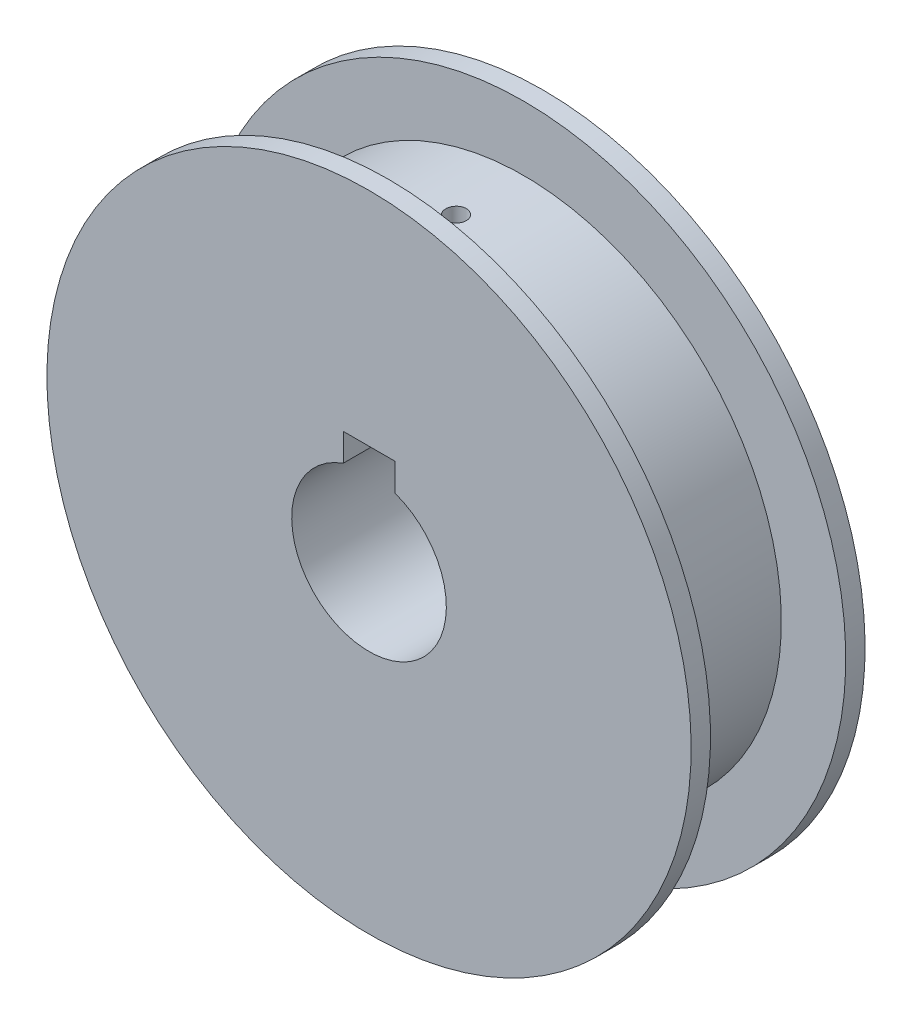
ISO-10303-21;
HEADER;
FILE_DESCRIPTION(('STEP AP214'),'2;1');
FILE_NAME('part.step','',(''),(''),'','','');
FILE_SCHEMA(('AUTOMOTIVE_DESIGN { 1 0 10303 214 1 1 1 1 }'));
ENDSEC;
DATA;
#1=APPLICATION_CONTEXT('core data for automotive mechanical design processes');
#2=APPLICATION_PROTOCOL_DEFINITION('international standard','automotive_design',2000,#1);
#3=PRODUCT_CONTEXT('',#1,'mechanical');
#4=PRODUCT('Part','Part','',(#3));
#5=PRODUCT_RELATED_PRODUCT_CATEGORY('part','',(#4));
#6=PRODUCT_DEFINITION_FORMATION('','',#4);
#7=PRODUCT_DEFINITION_CONTEXT('part definition',#1,'design');
#8=PRODUCT_DEFINITION('design','',#6,#7);
#9=PRODUCT_DEFINITION_SHAPE('','',#8);
#10=(LENGTH_UNIT() NAMED_UNIT(*) SI_UNIT(.MILLI.,.METRE.));
#11=(NAMED_UNIT(*) PLANE_ANGLE_UNIT() SI_UNIT($,.RADIAN.));
#12=(NAMED_UNIT(*) SI_UNIT($,.STERADIAN.) SOLID_ANGLE_UNIT());
#13=UNCERTAINTY_MEASURE_WITH_UNIT(LENGTH_MEASURE(1.E-05),#10,'distance_accuracy_value','');
#14=(GEOMETRIC_REPRESENTATION_CONTEXT(3) GLOBAL_UNCERTAINTY_ASSIGNED_CONTEXT((#13)) GLOBAL_UNIT_ASSIGNED_CONTEXT((#10,
#11,#12)) REPRESENTATION_CONTEXT('',''));
#15=CARTESIAN_POINT('',(0.,0.,0.));
#16=DIRECTION('',(0.,0.,1.));
#17=DIRECTION('',(1.,0.,0.));
#18=AXIS2_PLACEMENT_3D('',#15,#16,#17);
#19=CARTESIAN_POINT('',(-5.,25.001,-1.5));
#20=DIRECTION('',(1.,0.,0.));
#21=DIRECTION('',(0.,0.,-1.));
#22=AXIS2_PLACEMENT_3D('',#19,#20,#21);
#23=PLANE('',#22);
#24=DIRECTION('',(0.,0.,1.));
#25=VECTOR('',#24,1.);
#26=CARTESIAN_POINT('',(-5.,-24.4948974278318,-27.8315493850579));
#27=LINE('',#26,#25);
#28=CARTESIAN_POINT('',(-5.,-24.4948974278318,-9.));
#29=VERTEX_POINT('',#28);
#30=CARTESIAN_POINT('',(-5.,-24.4948974278318,-4.5));
#31=VERTEX_POINT('',#30);
#32=EDGE_CURVE('E303',#29,#31,#27,.T.);
#33=ORIENTED_EDGE('',*,*,#32,.T.);
#34=DIRECTION('',(0.,1.,0.));
#35=VECTOR('',#34,1.);
#36=CARTESIAN_POINT('',(-5.,25.001,-4.5));
#37=LINE('',#36,#35);
#38=CARTESIAN_POINT('',(-5.,-19.3649167310371,-4.5));
#39=VERTEX_POINT('',#38);
#40=EDGE_CURVE('E251',#31,#39,#37,.T.);
#41=ORIENTED_EDGE('',*,*,#40,.T.);
#42=DIRECTION('',(0.,0.,-1.));
#43=VECTOR('',#42,1.);
#44=CARTESIAN_POINT('',(-5.,-19.3649167310371,-13.5));
#45=LINE('',#44,#43);
#46=CARTESIAN_POINT('',(-5.,-19.3649167310371,-9.));
#47=VERTEX_POINT('',#46);
#48=EDGE_CURVE('E60',#39,#47,#45,.T.);
#49=ORIENTED_EDGE('',*,*,#48,.T.);
#50=DIRECTION('',(0.,1.,0.));
#51=VECTOR('',#50,1.);
#52=CARTESIAN_POINT('',(-5.,25.001,-9.));
#53=LINE('',#52,#51);
#54=EDGE_CURVE('E443',#29,#47,#53,.T.);
#55=ORIENTED_EDGE('',*,*,#54,.F.);
#56=EDGE_LOOP('',(#33,#41,#49,#55));
#57=FACE_BOUND('',#56,.T.);
#58=ADVANCED_FACE('F37',(#57),#23,.F.);
#59=CARTESIAN_POINT('',(0.,0.,-13.5));
#60=DIRECTION('',(0.,0.,-1.));
#61=DIRECTION('',(0.,1.,0.));
#62=AXIS2_PLACEMENT_3D('',#59,#60,#61);
#63=CYLINDRICAL_SURFACE('',#62,25.);
#64=CARTESIAN_POINT('',(0.,0.,-3.));
#65=DIRECTION('',(0.,0.,1.));
#66=DIRECTION('',(0.,-1.,0.));
#67=AXIS2_PLACEMENT_3D('',#64,#65,#66);
#68=CIRCLE('',#67,25.);
#69=CARTESIAN_POINT('',(-2.5,-24.8746859276655,-3.));
#70=VERTEX_POINT('',#69);
#71=CARTESIAN_POINT('',(-5.,-24.4948974278318,-3.));
#72=VERTEX_POINT('',#71);
#73=EDGE_CURVE('E249',#70,#72,#68,.F.);
#74=ORIENTED_EDGE('',*,*,#73,.F.);
#75=DIRECTION('',(0.,0.,-1.));
#76=VECTOR('',#75,1.);
#77=CARTESIAN_POINT('',(-2.5,-24.8746859276655,-13.5));
#78=LINE('',#77,#76);
#79=CARTESIAN_POINT('',(-2.5,-24.8746859276655,-1.49999999999999));
#80=VERTEX_POINT('',#79);
#81=EDGE_CURVE('E11',#80,#70,#78,.T.);
#82=ORIENTED_EDGE('',*,*,#81,.F.);
#83=CARTESIAN_POINT('',(0.,0.,-1.5));
#84=DIRECTION('',(0.,0.,1.));
#85=DIRECTION('',(0.,-1.,0.));
#86=AXIS2_PLACEMENT_3D('',#83,#84,#85);
#87=CIRCLE('',#86,25.);
#88=CARTESIAN_POINT('',(2.5,-24.8746859276655,-1.49999999999999));
#89=VERTEX_POINT('',#88);
#90=EDGE_CURVE('E469',#89,#80,#87,.F.);
#91=ORIENTED_EDGE('',*,*,#90,.F.);
#92=DIRECTION('',(0.,0.,-1.));
#93=VECTOR('',#92,1.);
#94=CARTESIAN_POINT('',(2.5,-24.8746859276655,-13.5));
#95=LINE('',#94,#93);
#96=CARTESIAN_POINT('',(2.5,-24.8746859276655,-5.99999999999999));
#97=VERTEX_POINT('',#96);
#98=EDGE_CURVE('E473',#97,#89,#95,.F.);
#99=ORIENTED_EDGE('',*,*,#98,.F.);
#100=CARTESIAN_POINT('',(0.,0.,-6.));
#101=DIRECTION('',(0.,0.,-1.));
#102=DIRECTION('',(0.,1.,0.));
#103=AXIS2_PLACEMENT_3D('',#100,#101,#102);
#104=CIRCLE('',#103,25.);
#105=CARTESIAN_POINT('',(-2.5,-24.8746859276655,-6.));
#106=VERTEX_POINT('',#105);
#107=EDGE_CURVE('E471',#106,#97,#104,.F.);
#108=ORIENTED_EDGE('',*,*,#107,.F.);
#109=DIRECTION('',(0.,0.,-1.));
#110=VECTOR('',#109,1.);
#111=CARTESIAN_POINT('',(-2.5,-24.8746859276655,-13.5));
#112=LINE('',#111,#110);
#113=CARTESIAN_POINT('',(-2.5,-24.8746859276655,-4.5));
#114=VERTEX_POINT('',#113);
#115=EDGE_CURVE('E45',#114,#106,#112,.T.);
#116=ORIENTED_EDGE('',*,*,#115,.F.);
#117=CARTESIAN_POINT('',(0.,0.,-4.5));
#118=DIRECTION('',(0.,0.,-1.));
#119=DIRECTION('',(0.,1.,0.));
#120=AXIS2_PLACEMENT_3D('',#117,#118,#119);
#121=CIRCLE('',#120,25.);
#122=EDGE_CURVE('E253',#31,#114,#121,.F.);
#123=ORIENTED_EDGE('',*,*,#122,.F.);
#124=ORIENTED_EDGE('',*,*,#32,.F.);
#125=CARTESIAN_POINT('',(0.,0.,-9.));
#126=DIRECTION('',(0.,0.,-1.));
#127=DIRECTION('',(0.,1.,0.));
#128=AXIS2_PLACEMENT_3D('',#125,#126,#127);
#129=CIRCLE('',#128,25.);
#130=CARTESIAN_POINT('',(-2.5,-24.8746859276655,-9.00000000000001));
#131=VERTEX_POINT('',#130);
#132=EDGE_CURVE('E274',#29,#131,#129,.F.);
#133=ORIENTED_EDGE('',*,*,#132,.T.);
#134=DIRECTION('',(0.,0.,-1.));
#135=VECTOR('',#134,1.);
#136=CARTESIAN_POINT('',(-2.5,-24.8746859276655,-13.5));
#137=LINE('',#136,#135);
#138=CARTESIAN_POINT('',(-2.5,-24.8746859276655,-7.50000000000001));
#139=VERTEX_POINT('',#138);
#140=EDGE_CURVE('E442',#131,#139,#137,.F.);
#141=ORIENTED_EDGE('',*,*,#140,.T.);
#142=CARTESIAN_POINT('',(0.,0.,-7.5));
#143=DIRECTION('',(0.,0.,-1.));
#144=DIRECTION('',(0.,1.,0.));
#145=AXIS2_PLACEMENT_3D('',#142,#143,#144);
#146=CIRCLE('',#145,25.);
#147=CARTESIAN_POINT('',(2.5,-24.8746859276655,-7.50000000000001));
#148=VERTEX_POINT('',#147);
#149=EDGE_CURVE('E459',#139,#148,#146,.F.);
#150=ORIENTED_EDGE('',*,*,#149,.T.);
#151=DIRECTION('',(0.,0.,-1.));
#152=VECTOR('',#151,1.);
#153=CARTESIAN_POINT('',(2.5,-24.8746859276655,-13.5));
#154=LINE('',#153,#152);
#155=CARTESIAN_POINT('',(2.5,-24.8746859276655,-12.));
#156=VERTEX_POINT('',#155);
#157=EDGE_CURVE('E463',#148,#156,#154,.T.);
#158=ORIENTED_EDGE('',*,*,#157,.T.);
#159=CARTESIAN_POINT('',(0.,0.,-12.));
#160=DIRECTION('',(0.,0.,1.));
#161=DIRECTION('',(0.,-1.,0.));
#162=AXIS2_PLACEMENT_3D('',#159,#160,#161);
#163=CIRCLE('',#162,25.);
#164=CARTESIAN_POINT('',(-2.5,-24.8746859276655,-12.));
#165=VERTEX_POINT('',#164);
#166=EDGE_CURVE('E461',#156,#165,#163,.F.);
#167=ORIENTED_EDGE('',*,*,#166,.T.);
#168=DIRECTION('',(0.,0.,-1.));
#169=VECTOR('',#168,1.);
#170=CARTESIAN_POINT('',(-2.5,-24.8746859276655,-13.5));
#171=LINE('',#170,#169);
#172=CARTESIAN_POINT('',(-2.5,-24.8746859276655,-10.5));
#173=VERTEX_POINT('',#172);
#174=EDGE_CURVE('E466',#165,#173,#171,.F.);
#175=ORIENTED_EDGE('',*,*,#174,.T.);
#176=CARTESIAN_POINT('',(0.,0.,-10.5));
#177=DIRECTION('',(0.,0.,1.));
#178=DIRECTION('',(0.,-1.,0.));
#179=AXIS2_PLACEMENT_3D('',#176,#177,#178);
#180=CIRCLE('',#179,25.);
#181=CARTESIAN_POINT('',(-5.,-24.4948974278318,-10.5));
#182=VERTEX_POINT('',#181);
#183=EDGE_CURVE('E295',#173,#182,#180,.F.);
#184=ORIENTED_EDGE('',*,*,#183,.T.);
#185=CARTESIAN_POINT('',(-5.,-24.4948974278318,-12.));
#186=VERTEX_POINT('',#185);
#187=EDGE_CURVE('E299',#186,#182,#27,.T.);
#188=ORIENTED_EDGE('',*,*,#187,.F.);
#189=CARTESIAN_POINT('',(0.,0.,-12.));
#190=DIRECTION('',(0.,0.,-1.));
#191=DIRECTION('',(0.,1.,0.));
#192=AXIS2_PLACEMENT_3D('',#189,#190,#191);
#193=CIRCLE('',#192,25.);
#194=CARTESIAN_POINT('',(5.,-24.4948974278318,-12.));
#195=VERTEX_POINT('',#194);
#196=EDGE_CURVE('E353',#186,#195,#193,.T.);
#197=ORIENTED_EDGE('',*,*,#196,.T.);
#198=DIRECTION('',(0.,0.,1.));
#199=VECTOR('',#198,1.);
#200=CARTESIAN_POINT('',(5.,-24.4948974278318,-27.8315493850579));
#201=LINE('',#200,#199);
#202=CARTESIAN_POINT('',(5.,-24.4948974278318,-1.5));
#203=VERTEX_POINT('',#202);
#204=EDGE_CURVE('E379',#203,#195,#201,.F.);
#205=ORIENTED_EDGE('',*,*,#204,.F.);
#206=CARTESIAN_POINT('',(0.,0.,-1.5));
#207=DIRECTION('',(0.,0.,-1.));
#208=DIRECTION('',(0.,1.,0.));
#209=AXIS2_PLACEMENT_3D('',#206,#207,#208);
#210=CIRCLE('',#209,25.);
#211=CARTESIAN_POINT('',(-5.,-24.4948974278318,-1.5));
#212=VERTEX_POINT('',#211);
#213=EDGE_CURVE('E361',#212,#203,#210,.T.);
#214=ORIENTED_EDGE('',*,*,#213,.F.);
#215=EDGE_CURVE('E298',#72,#212,#27,.T.);
#216=ORIENTED_EDGE('',*,*,#215,.F.);
#217=EDGE_LOOP('',(#74,#82,#91,#99,#108,#116,#123,#124,#133,#141,#150,#158,#167,#175,#184,#188,
#197,#205,#214,#216));
#218=FACE_BOUND('',#217,.T.);
#219=CARTESIAN_POINT('',(0.,0.,-13.5));
#220=DIRECTION('',(0.,0.,-1.));
#221=DIRECTION('',(0.,1.,0.));
#222=AXIS2_PLACEMENT_3D('',#219,#220,#221);
#223=CIRCLE('',#222,25.);
#224=CARTESIAN_POINT('',(0.,25.,-13.5));
#225=VERTEX_POINT('',#224);
#226=EDGE_CURVE('E350',#225,#225,#223,.T.);
#227=ORIENTED_EDGE('',*,*,#226,.F.);
#228=EDGE_LOOP('',(#227));
#229=FACE_BOUND('',#228,.T.);
#230=CARTESIAN_POINT('',(0.,0.,0.));
#231=DIRECTION('',(0.,0.,-1.));
#232=DIRECTION('',(0.,1.,0.));
#233=AXIS2_PLACEMENT_3D('',#230,#231,#232);
#234=CIRCLE('',#233,25.);
#235=CARTESIAN_POINT('',(0.,25.,0.));
#236=VERTEX_POINT('',#235);
#237=EDGE_CURVE('E363',#236,#236,#234,.T.);
#238=ORIENTED_EDGE('',*,*,#237,.T.);
#239=EDGE_LOOP('',(#238));
#240=FACE_BOUND('',#239,.T.);
#241=ADVANCED_FACE('F411',(#218,#229,#240),#63,.T.);
#242=DIRECTION('',(0.,-1.,0.));
#243=VECTOR('',#242,1.);
#244=CARTESIAN_POINT('',(-5.,25.001,-10.5));
#245=LINE('',#244,#243);
#246=CARTESIAN_POINT('',(-5.,-19.3649167310371,-10.5));
#247=VERTEX_POINT('',#246);
#248=EDGE_CURVE('E438',#247,#182,#245,.T.);
#249=ORIENTED_EDGE('',*,*,#248,.F.);
#250=CARTESIAN_POINT('',(-5.,-19.3649167310371,-12.));
#251=VERTEX_POINT('',#250);
#252=EDGE_CURVE('E307',#247,#251,#45,.T.);
#253=ORIENTED_EDGE('',*,*,#252,.T.);
#254=DIRECTION('',(0.,-1.,0.));
#255=VECTOR('',#254,1.);
#256=CARTESIAN_POINT('',(-5.,25.001,-12.));
#257=LINE('',#256,#255);
#258=EDGE_CURVE('E315',#251,#186,#257,.T.);
#259=ORIENTED_EDGE('',*,*,#258,.T.);
#260=ORIENTED_EDGE('',*,*,#187,.T.);
#261=EDGE_LOOP('',(#249,#253,#259,#260));
#262=FACE_BOUND('',#261,.T.);
#263=ADVANCED_FACE('F413',(#262),#23,.F.);
#264=CARTESIAN_POINT('',(-5.,-19.3649167310371,-1.5));
#265=VERTEX_POINT('',#264);
#266=CARTESIAN_POINT('',(-5.,-19.3649167310371,-3.));
#267=VERTEX_POINT('',#266);
#268=EDGE_CURVE('E304',#265,#267,#45,.T.);
#269=ORIENTED_EDGE('',*,*,#268,.T.);
#270=DIRECTION('',(0.,-1.,0.));
#271=VECTOR('',#270,1.);
#272=CARTESIAN_POINT('',(-5.,25.001,-3.));
#273=LINE('',#272,#271);
#274=EDGE_CURVE('E204',#267,#72,#273,.T.);
#275=ORIENTED_EDGE('',*,*,#274,.T.);
#276=ORIENTED_EDGE('',*,*,#215,.T.);
#277=DIRECTION('',(0.,-1.,0.));
#278=VECTOR('',#277,1.);
#279=CARTESIAN_POINT('',(-5.,25.001,-1.5));
#280=LINE('',#279,#278);
#281=EDGE_CURVE('E312',#265,#212,#280,.T.);
#282=ORIENTED_EDGE('',*,*,#281,.F.);
#283=EDGE_LOOP('',(#269,#275,#276,#282));
#284=FACE_BOUND('',#283,.T.);
#285=ADVANCED_FACE('F426',(#284),#23,.F.);
#286=CARTESIAN_POINT('',(0.,25.,-1.49999999999999));
#287=DIRECTION('',(0.,0.,-1.));
#288=DIRECTION('',(0.,1.,0.));
#289=AXIS2_PLACEMENT_3D('',#286,#287,#288);
#290=PLANE('',#289);
#291=CARTESIAN_POINT('',(0.,0.,-1.5));
#292=DIRECTION('',(0.,0.,-1.));
#293=DIRECTION('',(0.,1.,0.));
#294=AXIS2_PLACEMENT_3D('',#291,#292,#293);
#295=CIRCLE('',#294,20.);
#296=CARTESIAN_POINT('',(5.,-19.3649167310371,-1.5));
#297=VERTEX_POINT('',#296);
#298=EDGE_CURVE('E358',#265,#297,#295,.T.);
#299=ORIENTED_EDGE('',*,*,#298,.F.);
#300=ORIENTED_EDGE('',*,*,#281,.T.);
#301=ORIENTED_EDGE('',*,*,#213,.T.);
#302=DIRECTION('',(0.,-1.,0.));
#303=VECTOR('',#302,1.);
#304=CARTESIAN_POINT('',(5.,25.001,-1.5));
#305=LINE('',#304,#303);
#306=EDGE_CURVE('E302',#297,#203,#305,.T.);
#307=ORIENTED_EDGE('',*,*,#306,.F.);
#308=EDGE_LOOP('',(#299,#300,#301,#307));
#309=FACE_BOUND('',#308,.T.);
#310=ADVANCED_FACE('F423',(#309),#290,.T.);
#311=CARTESIAN_POINT('',(0.,0.,-13.5));
#312=DIRECTION('',(0.,0.,-1.));
#313=DIRECTION('',(0.,1.,0.));
#314=AXIS2_PLACEMENT_3D('',#311,#312,#313);
#315=CYLINDRICAL_SURFACE('',#314,20.);
#316=ORIENTED_EDGE('',*,*,#48,.F.);
#317=CARTESIAN_POINT('',(0.,0.,-4.5));
#318=DIRECTION('',(0.,0.,-1.));
#319=DIRECTION('',(0.,1.,0.));
#320=AXIS2_PLACEMENT_3D('',#317,#318,#319);
#321=CIRCLE('',#320,20.);
#322=CARTESIAN_POINT('',(-2.5,-19.8431348329844,-4.5));
#323=VERTEX_POINT('',#322);
#324=EDGE_CURVE('E239',#323,#39,#321,.T.);
#325=ORIENTED_EDGE('',*,*,#324,.F.);
#326=DIRECTION('',(0.,0.,-1.));
#327=VECTOR('',#326,1.);
#328=CARTESIAN_POINT('',(-2.5,-19.8431348329844,-13.5));
#329=LINE('',#328,#327);
#330=CARTESIAN_POINT('',(-2.5,-19.8431348329844,-6.));
#331=VERTEX_POINT('',#330);
#332=EDGE_CURVE('E241',#331,#323,#329,.F.);
#333=ORIENTED_EDGE('',*,*,#332,.F.);
#334=CARTESIAN_POINT('',(0.,0.,-6.));
#335=DIRECTION('',(0.,0.,-1.));
#336=DIRECTION('',(0.,1.,0.));
#337=AXIS2_PLACEMENT_3D('',#334,#335,#336);
#338=CIRCLE('',#337,20.);
#339=CARTESIAN_POINT('',(2.5,-19.8431348329844,-6.));
#340=VERTEX_POINT('',#339);
#341=EDGE_CURVE('E243',#340,#331,#338,.T.);
#342=ORIENTED_EDGE('',*,*,#341,.F.);
#343=DIRECTION('',(0.,0.,-1.));
#344=VECTOR('',#343,1.);
#345=CARTESIAN_POINT('',(2.5,-19.8431348329844,-13.5));
#346=LINE('',#345,#344);
#347=CARTESIAN_POINT('',(2.5,-19.8431348329844,-1.5));
#348=VERTEX_POINT('',#347);
#349=EDGE_CURVE('E245',#348,#340,#346,.T.);
#350=ORIENTED_EDGE('',*,*,#349,.F.);
#351=CARTESIAN_POINT('',(0.,0.,-1.5));
#352=DIRECTION('',(0.,0.,1.));
#353=DIRECTION('',(0.,-1.,0.));
#354=AXIS2_PLACEMENT_3D('',#351,#352,#353);
#355=CIRCLE('',#354,20.);
#356=CARTESIAN_POINT('',(-2.5,-19.8431348329844,-1.5));
#357=VERTEX_POINT('',#356);
#358=EDGE_CURVE('E213',#357,#348,#355,.T.);
#359=ORIENTED_EDGE('',*,*,#358,.F.);
#360=DIRECTION('',(0.,0.,-1.));
#361=VECTOR('',#360,1.);
#362=CARTESIAN_POINT('',(-2.5,-19.8431348329844,-13.5));
#363=LINE('',#362,#361);
#364=CARTESIAN_POINT('',(-2.5,-19.8431348329844,-3.));
#365=VERTEX_POINT('',#364);
#366=EDGE_CURVE('E206',#365,#357,#363,.F.);
#367=ORIENTED_EDGE('',*,*,#366,.F.);
#368=CARTESIAN_POINT('',(0.,0.,-3.));
#369=DIRECTION('',(0.,0.,1.));
#370=DIRECTION('',(0.,-1.,0.));
#371=AXIS2_PLACEMENT_3D('',#368,#369,#370);
#372=CIRCLE('',#371,20.);
#373=EDGE_CURVE('E52',#267,#365,#372,.T.);
#374=ORIENTED_EDGE('',*,*,#373,.F.);
#375=ORIENTED_EDGE('',*,*,#268,.F.);
#376=ORIENTED_EDGE('',*,*,#298,.T.);
#377=DIRECTION('',(0.,0.,-1.));
#378=VECTOR('',#377,1.);
#379=CARTESIAN_POINT('',(5.,-19.3649167310371,-13.5));
#380=LINE('',#379,#378);
#381=CARTESIAN_POINT('',(5.,-19.3649167310371,-12.));
#382=VERTEX_POINT('',#381);
#383=EDGE_CURVE('E306',#382,#297,#380,.F.);
#384=ORIENTED_EDGE('',*,*,#383,.F.);
#385=CARTESIAN_POINT('',(0.,0.,-12.));
#386=DIRECTION('',(0.,0.,-1.));
#387=DIRECTION('',(0.,1.,0.));
#388=AXIS2_PLACEMENT_3D('',#385,#386,#387);
#389=CIRCLE('',#388,20.);
#390=EDGE_CURVE('E355',#251,#382,#389,.T.);
#391=ORIENTED_EDGE('',*,*,#390,.F.);
#392=ORIENTED_EDGE('',*,*,#252,.F.);
#393=CARTESIAN_POINT('',(0.,0.,-10.5));
#394=DIRECTION('',(0.,0.,1.));
#395=DIRECTION('',(0.,-1.,0.));
#396=AXIS2_PLACEMENT_3D('',#393,#394,#395);
#397=CIRCLE('',#396,20.);
#398=CARTESIAN_POINT('',(-2.5,-19.8431348329844,-10.5));
#399=VERTEX_POINT('',#398);
#400=EDGE_CURVE('E260',#247,#399,#397,.T.);
#401=ORIENTED_EDGE('',*,*,#400,.T.);
#402=DIRECTION('',(0.,0.,-1.));
#403=VECTOR('',#402,1.);
#404=CARTESIAN_POINT('',(-2.5,-19.8431348329844,-13.5));
#405=LINE('',#404,#403);
#406=CARTESIAN_POINT('',(-2.5,-19.8431348329844,-12.));
#407=VERTEX_POINT('',#406);
#408=EDGE_CURVE('E256',#399,#407,#405,.T.);
#409=ORIENTED_EDGE('',*,*,#408,.T.);
#410=CARTESIAN_POINT('',(0.,0.,-12.));
#411=DIRECTION('',(0.,0.,1.));
#412=DIRECTION('',(0.,-1.,0.));
#413=AXIS2_PLACEMENT_3D('',#410,#411,#412);
#414=CIRCLE('',#413,20.);
#415=CARTESIAN_POINT('',(2.5,-19.8431348329844,-12.));
#416=VERTEX_POINT('',#415);
#417=EDGE_CURVE('E259',#407,#416,#414,.T.);
#418=ORIENTED_EDGE('',*,*,#417,.T.);
#419=DIRECTION('',(0.,0.,-1.));
#420=VECTOR('',#419,1.);
#421=CARTESIAN_POINT('',(2.5,-19.8431348329844,-13.5));
#422=LINE('',#421,#420);
#423=CARTESIAN_POINT('',(2.5,-19.8431348329844,-7.5));
#424=VERTEX_POINT('',#423);
#425=EDGE_CURVE('E263',#416,#424,#422,.F.);
#426=ORIENTED_EDGE('',*,*,#425,.T.);
#427=CARTESIAN_POINT('',(0.,0.,-7.5));
#428=DIRECTION('',(0.,0.,-1.));
#429=DIRECTION('',(0.,1.,0.));
#430=AXIS2_PLACEMENT_3D('',#427,#428,#429);
#431=CIRCLE('',#430,20.);
#432=CARTESIAN_POINT('',(-2.5,-19.8431348329844,-7.50000000000001));
#433=VERTEX_POINT('',#432);
#434=EDGE_CURVE('E266',#424,#433,#431,.T.);
#435=ORIENTED_EDGE('',*,*,#434,.T.);
#436=DIRECTION('',(0.,0.,-1.));
#437=VECTOR('',#436,1.);
#438=CARTESIAN_POINT('',(-2.5,-19.8431348329844,-13.5));
#439=LINE('',#438,#437);
#440=CARTESIAN_POINT('',(-2.5,-19.8431348329844,-9.00000000000001));
#441=VERTEX_POINT('',#440);
#442=EDGE_CURVE('E269',#433,#441,#439,.T.);
#443=ORIENTED_EDGE('',*,*,#442,.T.);
#444=CARTESIAN_POINT('',(0.,0.,-9.));
#445=DIRECTION('',(0.,0.,-1.));
#446=DIRECTION('',(0.,1.,0.));
#447=AXIS2_PLACEMENT_3D('',#444,#445,#446);
#448=CIRCLE('',#447,20.);
#449=EDGE_CURVE('E272',#441,#47,#448,.T.);
#450=ORIENTED_EDGE('',*,*,#449,.T.);
#451=EDGE_LOOP('',(#316,#325,#333,#342,#350,#359,#367,#374,#375,#376,#384,#391,#392,#401,#409,
#418,#426,#435,#443,#450));
#452=FACE_BOUND('',#451,.T.);
#453=CARTESIAN_POINT('',(0.,20.,-5.95));
#454=CARTESIAN_POINT('',(0.0449170776075552,19.9999997850882,-5.95000198590727));
#455=CARTESIAN_POINT('',(0.089866266739946,19.9998470621129,-5.9537955957736));
#456=CARTESIAN_POINT('',(0.178525399241915,19.9992525018453,-5.96887567449927));
#457=CARTESIAN_POINT('',(0.222233806810838,19.9988103212712,-5.98017104028782));
#458=CARTESIAN_POINT('',(0.307114183653224,19.9976869091762,-6.00993137828988));
#459=CARTESIAN_POINT('',(0.348287404625545,19.9970057967541,-6.02839277898816));
#460=CARTESIAN_POINT('',(0.426939039920081,19.9954812971819,-6.0719558502667));
#461=CARTESIAN_POINT('',(0.464418340187697,19.9946379490862,-6.09705592329022));
#462=CARTESIAN_POINT('',(0.534655784780948,19.9928832406046,-6.15320374631375));
#463=CARTESIAN_POINT('',(0.567411065428611,19.9919718394692,-6.18425507760059));
#464=CARTESIAN_POINT('',(0.627246381318315,19.9901841002449,-6.25141716041143));
#465=CARTESIAN_POINT('',(0.654326188024766,19.9893077635691,-6.28752811557479));
#466=CARTESIAN_POINT('',(0.702048507077295,19.9876887180069,-6.36379780877853));
#467=CARTESIAN_POINT('',(0.722688972886383,19.986946051635,-6.4039578283287));
#468=CARTESIAN_POINT('',(0.756933515446094,19.9856785468868,-6.48717659371423));
#469=CARTESIAN_POINT('',(0.770537631412103,19.9851537072967,-6.53023532339282));
#470=CARTESIAN_POINT('',(0.790316252791007,19.9843813807057,-6.61800459820148));
#471=CARTESIAN_POINT('',(0.796494766466025,19.9841337440787,-6.66271423874045));
#472=CARTESIAN_POINT('',(0.801259157483669,19.9839432975028,-6.75253672879596));
#473=CARTESIAN_POINT('',(0.79984507808183,19.9840004858174,-6.79764957601394));
#474=CARTESIAN_POINT('',(0.789467779945968,19.9844131009137,-6.88697068277283));
#475=CARTESIAN_POINT('',(0.780508890478336,19.9847683566616,-6.93117944618589));
#476=CARTESIAN_POINT('',(0.755302985788658,19.9857367925551,-7.01746504638847));
#477=CARTESIAN_POINT('',(0.739055948054133,19.9863499734973,-7.05954187659219));
#478=CARTESIAN_POINT('',(0.69972998058001,19.9877653394208,-7.14038315634962));
#479=CARTESIAN_POINT('',(0.676649070956821,19.9885675791617,-7.17914664177366));
#480=CARTESIAN_POINT('',(0.624311995360964,19.9902705768664,-7.25225032189191));
#481=CARTESIAN_POINT('',(0.595055802376957,19.9911713352612,-7.28659049723704));
#482=CARTESIAN_POINT('',(0.531174173590374,19.9929705967384,-7.3498979726601));
#483=CARTESIAN_POINT('',(0.496544986622641,19.9938690977962,-7.37886148774555));
#484=CARTESIAN_POINT('',(0.422913574295172,19.9955619553677,-7.43056432334682));
#485=CARTESIAN_POINT('',(0.38391134808537,19.9963563118611,-7.45330364265272));
#486=CARTESIAN_POINT('',(0.302638833016186,19.997751364755,-7.49191220587288));
#487=CARTESIAN_POINT('',(0.260368484812075,19.9983520576378,-7.50778132499892));
#488=CARTESIAN_POINT('',(0.173760587264703,19.9992920223455,-7.53219658028996));
#489=CARTESIAN_POINT('',(0.129423047856704,19.9996312954267,-7.54074275164643));
#490=CARTESIAN_POINT('',(0.0399722241790224,20.0000100185083,-7.55026486705711));
#491=CARTESIAN_POINT('',(-0.00514050181814157,20.0000496759043,-7.55124604765152));
#492=CARTESIAN_POINT('',(-0.0948900000543854,19.999825247634,-7.54562398422181));
#493=CARTESIAN_POINT('',(-0.139526773291606,19.9995611626048,-7.53902075610643));
#494=CARTESIAN_POINT('',(-0.22704266098296,19.9987591377445,-7.51842165055114));
#495=CARTESIAN_POINT('',(-0.269922337339822,19.9982212862117,-7.50442815664505));
#496=CARTESIAN_POINT('',(-0.352724113852981,19.9969323126594,-7.46944816001693));
#497=CARTESIAN_POINT('',(-0.392646203194809,19.9961811898603,-7.4484616317263));
#498=CARTESIAN_POINT('',(-0.468423643143899,19.9945497202218,-7.40007784501774));
#499=CARTESIAN_POINT('',(-0.504276745793303,19.9936693025622,-7.37267706832848));
#500=CARTESIAN_POINT('',(-0.570875886572311,19.9918786719058,-7.31224774663548));
#501=CARTESIAN_POINT('',(-0.601621903054593,19.9909684587827,-7.27921917777851));
#502=CARTESIAN_POINT('',(-0.657151657605674,19.9892202492002,-7.20844935144158));
#503=CARTESIAN_POINT('',(-0.681932013097038,19.9883822938835,-7.17070543865901));
#504=CARTESIAN_POINT('',(-0.724803906591642,19.9868737284937,-7.09158981402047));
#505=CARTESIAN_POINT('',(-0.742895465835813,19.9862031178892,-7.05021811368541));
#506=CARTESIAN_POINT('',(-0.771870295122693,19.9851051505243,-6.96503395047018));
#507=CARTESIAN_POINT('',(-0.782755739466311,19.9846777203945,-6.92122222814728));
#508=CARTESIAN_POINT('',(-0.797016460309503,19.9841141027269,-6.83239125102042));
#509=CARTESIAN_POINT('',(-0.800391759146809,19.9839779143228,-6.78737199980847));
#510=CARTESIAN_POINT('',(-0.799536130989075,19.9840121620678,-6.69743763023949));
#511=CARTESIAN_POINT('',(-0.795310530124425,19.9841823835083,-6.65252246103037));
#512=CARTESIAN_POINT('',(-0.779384035658974,19.9848098107813,-6.56403967189433));
#513=CARTESIAN_POINT('',(-0.767683127459742,19.9852670171742,-6.52047205459919));
#514=CARTESIAN_POINT('',(-0.737139124468102,19.9864168351489,-6.43591963962932));
#515=CARTESIAN_POINT('',(-0.718295932956939,19.9871094499185,-6.39493487693963));
#516=CARTESIAN_POINT('',(-0.674003463339874,19.9886519861644,-6.316710893621));
#517=CARTESIAN_POINT('',(-0.64855440825455,19.9895019023298,-6.27947154660196));
#518=CARTESIAN_POINT('',(-0.591754600671318,19.9912638927368,-6.20976954880729));
#519=CARTESIAN_POINT('',(-0.560400356092061,19.992176003553,-6.17730974479473));
#520=CARTESIAN_POINT('',(-0.492678361244353,19.9939594087862,-6.1181051751648));
#521=CARTESIAN_POINT('',(-0.456309375037923,19.9948306930699,-6.09136182258608));
#522=CARTESIAN_POINT('',(-0.379569827174803,19.9964346777421,-6.04434130284942));
#523=CARTESIAN_POINT('',(-0.33919615518676,19.9971672691067,-6.02406921411289));
#524=CARTESIAN_POINT('',(-0.255646146001881,19.9984095195122,-5.99061511412432));
#525=CARTESIAN_POINT('',(-0.21247320574426,19.9989194431558,-5.97742468322653));
#526=CARTESIAN_POINT('',(-0.140857905551853,19.9995232318358,-5.96198831872653));
#527=CARTESIAN_POINT('',(-0.112879972303379,19.9997012397882,-5.95749839202776));
#528=CARTESIAN_POINT('',(-0.056605611042371,19.9999396915635,-5.95150360764731));
#529=CARTESIAN_POINT('',(-0.0283091831997362,20.0000001354491,-5.94999874837333));
#530=CARTESIAN_POINT('',(0.,20.,-5.95));
#531=B_SPLINE_CURVE_WITH_KNOTS('',3,(#453,#454,#455,#456,#457,#458,#459,#460,#461,#462,#463,
#464,#465,#466,#467,#468,#469,#470,#471,#472,#473,#474,#475,#476,#477,#478,#479,#480,#481,#482,
#483,#484,#485,#486,#487,#488,#489,#490,#491,#492,#493,#494,#495,#496,#497,#498,#499,#500,#501,
#502,#503,#504,#505,#506,#507,#508,#509,#510,#511,#512,#513,#514,#515,#516,#517,#518,#519,#520,
#521,#522,#523,#524,#525,#526,#527,#528,#529,#530),.UNSPECIFIED.,.T.,.F.,(4,2,2,2,2,2,2,2,2,2,2,
2,2,2,2,2,2,2,2,2,2,2,2,2,2,2,2,2,2,2,2,2,2,2,2,2,2,2,4),(0.,0.134647897640614,
0.269455770779941,0.404196542452709,0.538904919020579,0.673694614984303,0.808489737512757,
0.943327656787119,1.07816482456702,1.21292917592322,1.3476927595183,1.48237906744419,
1.61706579140765,1.75179157454643,1.88651794700213,2.02133880569248,2.15615969059045,
2.29098302423079,2.42580570995478,2.56053506207465,2.69526413159239,2.82994977434247,
2.96463590954864,3.09939609510183,3.23415685184621,3.36899383999359,3.50383039994916,
3.63862625710617,3.77342171333382,3.9081227519861,4.04282405369511,4.17752717955578,
4.31222575829523,4.44700424366399,4.58181600623903,4.71673330575451,4.85148983984744,
4.93635230726709,5.02121472941911),.UNSPECIFIED.);
#532=CARTESIAN_POINT('',(0.,20.,-5.95));
#533=VERTEX_POINT('',#532);
#534=EDGE_CURVE('E372',#533,#533,#531,.T.);
#535=ORIENTED_EDGE('',*,*,#534,.F.);
#536=EDGE_LOOP('',(#535));
#537=FACE_BOUND('',#536,.T.);
#538=ADVANCED_FACE('F210',(#452,#537),#315,.T.);
#539=CARTESIAN_POINT('',(0.,20.,-12.));
#540=DIRECTION('',(0.,0.,1.));
#541=DIRECTION('',(0.,-1.,0.));
#542=AXIS2_PLACEMENT_3D('',#539,#540,#541);
#543=PLANE('',#542);
#544=ORIENTED_EDGE('',*,*,#196,.F.);
#545=ORIENTED_EDGE('',*,*,#258,.F.);
#546=ORIENTED_EDGE('',*,*,#390,.T.);
#547=DIRECTION('',(0.,-1.,0.));
#548=VECTOR('',#547,1.);
#549=CARTESIAN_POINT('',(5.,25.001,-12.));
#550=LINE('',#549,#548);
#551=EDGE_CURVE('E318',#382,#195,#550,.T.);
#552=ORIENTED_EDGE('',*,*,#551,.T.);
#553=EDGE_LOOP('',(#544,#545,#546,#552));
#554=FACE_BOUND('',#553,.T.);
#555=ADVANCED_FACE('F415',(#554),#543,.T.);
#556=CARTESIAN_POINT('',(0.,0.,0.));
#557=DIRECTION('',(0.,0.,1.));
#558=DIRECTION('',(0.,-1.,0.));
#559=AXIS2_PLACEMENT_3D('',#556,#557,#558);
#560=PLANE('',#559);
#561=DIRECTION('',(0.,1.,0.));
#562=VECTOR('',#561,1.);
#563=CARTESIAN_POINT('',(-2.,7.8,0.));
#564=LINE('',#563,#562);
#565=CARTESIAN_POINT('',(-2.,5.65685424949238,0.));
#566=VERTEX_POINT('',#565);
#567=CARTESIAN_POINT('',(-2.,7.8,0.));
#568=VERTEX_POINT('',#567);
#569=EDGE_CURVE('E327',#566,#568,#564,.T.);
#570=ORIENTED_EDGE('',*,*,#569,.T.);
#571=DIRECTION('',(1.,0.,0.));
#572=VECTOR('',#571,1.);
#573=CARTESIAN_POINT('',(2.,7.8,0.));
#574=LINE('',#573,#572);
#575=CARTESIAN_POINT('',(2.,7.8,0.));
#576=VERTEX_POINT('',#575);
#577=EDGE_CURVE('E336',#568,#576,#574,.T.);
#578=ORIENTED_EDGE('',*,*,#577,.T.);
#579=DIRECTION('',(0.,-1.,0.));
#580=VECTOR('',#579,1.);
#581=CARTESIAN_POINT('',(2.,7.8,0.));
#582=LINE('',#581,#580);
#583=CARTESIAN_POINT('',(2.,5.65685424949238,0.));
#584=VERTEX_POINT('',#583);
#585=EDGE_CURVE('E331',#576,#584,#582,.T.);
#586=ORIENTED_EDGE('',*,*,#585,.T.);
#587=CARTESIAN_POINT('',(0.,0.,0.));
#588=DIRECTION('',(0.,0.,1.));
#589=DIRECTION('',(1.,0.,0.));
#590=AXIS2_PLACEMENT_3D('',#587,#588,#589);
#591=CIRCLE('',#590,6.);
#592=EDGE_CURVE('E334',#566,#584,#591,.T.);
#593=ORIENTED_EDGE('',*,*,#592,.F.);
#594=EDGE_LOOP('',(#570,#578,#586,#593));
#595=FACE_BOUND('',#594,.T.);
#596=ORIENTED_EDGE('',*,*,#237,.F.);
#597=EDGE_LOOP('',(#596));
#598=FACE_BOUND('',#597,.T.);
#599=ADVANCED_FACE('F39',(#595,#598),#560,.T.);
#600=CARTESIAN_POINT('',(0.,25.,-13.5));
#601=DIRECTION('',(0.,0.,-1.));
#602=DIRECTION('',(0.,1.,0.));
#603=AXIS2_PLACEMENT_3D('',#600,#601,#602);
#604=PLANE('',#603);
#605=DIRECTION('',(0.,1.,0.));
#606=VECTOR('',#605,1.);
#607=CARTESIAN_POINT('',(-2.,7.8,-13.5));
#608=LINE('',#607,#606);
#609=CARTESIAN_POINT('',(-2.,5.65685424949238,-13.5));
#610=VERTEX_POINT('',#609);
#611=CARTESIAN_POINT('',(-2.,7.8,-13.5));
#612=VERTEX_POINT('',#611);
#613=EDGE_CURVE('E328',#610,#612,#608,.T.);
#614=ORIENTED_EDGE('',*,*,#613,.F.);
#615=CARTESIAN_POINT('',(0.,0.,-13.5));
#616=DIRECTION('',(0.,0.,-1.));
#617=DIRECTION('',(0.,1.,0.));
#618=AXIS2_PLACEMENT_3D('',#615,#616,#617);
#619=CIRCLE('',#618,6.);
#620=CARTESIAN_POINT('',(2.,5.65685424949238,-13.5));
#621=VERTEX_POINT('',#620);
#622=EDGE_CURVE('E347',#610,#621,#619,.F.);
#623=ORIENTED_EDGE('',*,*,#622,.T.);
#624=DIRECTION('',(0.,-1.,0.));
#625=VECTOR('',#624,1.);
#626=CARTESIAN_POINT('',(2.,7.8,-13.5));
#627=LINE('',#626,#625);
#628=CARTESIAN_POINT('',(2.,7.8,-13.5));
#629=VERTEX_POINT('',#628);
#630=EDGE_CURVE('E323',#629,#621,#627,.T.);
#631=ORIENTED_EDGE('',*,*,#630,.F.);
#632=DIRECTION('',(1.,0.,0.));
#633=VECTOR('',#632,1.);
#634=CARTESIAN_POINT('',(2.,7.8,-13.5));
#635=LINE('',#634,#633);
#636=EDGE_CURVE('E324',#612,#629,#635,.T.);
#637=ORIENTED_EDGE('',*,*,#636,.F.);
#638=EDGE_LOOP('',(#614,#623,#631,#637));
#639=FACE_BOUND('',#638,.T.);
#640=ORIENTED_EDGE('',*,*,#226,.T.);
#641=EDGE_LOOP('',(#640));
#642=FACE_BOUND('',#641,.T.);
#643=ADVANCED_FACE('F406',(#639,#642),#604,.T.);
#644=CARTESIAN_POINT('',(0.,0.,-30.4705627484771));
#645=DIRECTION('',(0.,0.,1.));
#646=DIRECTION('',(1.,0.,0.));
#647=AXIS2_PLACEMENT_3D('',#644,#645,#646);
#648=CYLINDRICAL_SURFACE('',#647,6.);
#649=ORIENTED_EDGE('',*,*,#622,.F.);
#650=DIRECTION('',(0.,0.,1.));
#651=VECTOR('',#650,1.);
#652=CARTESIAN_POINT('',(-2.,5.65685424949238,-30.4705627484771));
#653=LINE('',#652,#651);
#654=EDGE_CURVE('E369',#610,#566,#653,.T.);
#655=ORIENTED_EDGE('',*,*,#654,.T.);
#656=ORIENTED_EDGE('',*,*,#592,.T.);
#657=DIRECTION('',(0.,0.,1.));
#658=VECTOR('',#657,1.);
#659=CARTESIAN_POINT('',(2.,5.65685424949238,-30.4705627484771));
#660=LINE('',#659,#658);
#661=EDGE_CURVE('E366',#584,#621,#660,.F.);
#662=ORIENTED_EDGE('',*,*,#661,.T.);
#663=EDGE_LOOP('',(#649,#655,#656,#662));
#664=FACE_BOUND('',#663,.T.);
#665=ADVANCED_FACE('F402',(#664),#648,.F.);
#666=CARTESIAN_POINT('',(-2.,7.8,8.76584280032445));
#667=DIRECTION('',(-1.,0.,0.));
#668=DIRECTION('',(0.,-1.,0.));
#669=AXIS2_PLACEMENT_3D('',#666,#667,#668);
#670=PLANE('',#669);
#671=ORIENTED_EDGE('',*,*,#613,.T.);
#672=DIRECTION('',(0.,0.,-1.));
#673=VECTOR('',#672,1.);
#674=CARTESIAN_POINT('',(-2.,7.8,8.76584280032445));
#675=LINE('',#674,#673);
#676=EDGE_CURVE('E339',#568,#612,#675,.T.);
#677=ORIENTED_EDGE('',*,*,#676,.F.);
#678=ORIENTED_EDGE('',*,*,#569,.F.);
#679=ORIENTED_EDGE('',*,*,#654,.F.);
#680=EDGE_LOOP('',(#671,#677,#678,#679));
#681=FACE_BOUND('',#680,.T.);
#682=ADVANCED_FACE('F395',(#681),#670,.F.);
#683=CARTESIAN_POINT('',(2.,7.8,8.76584280032445));
#684=DIRECTION('',(1.,0.,0.));
#685=DIRECTION('',(0.,1.,0.));
#686=AXIS2_PLACEMENT_3D('',#683,#684,#685);
#687=PLANE('',#686);
#688=ORIENTED_EDGE('',*,*,#585,.F.);
#689=DIRECTION('',(0.,0.,-1.));
#690=VECTOR('',#689,1.);
#691=CARTESIAN_POINT('',(2.,7.8,8.76584280032445));
#692=LINE('',#691,#690);
#693=EDGE_CURVE('E335',#576,#629,#692,.T.);
#694=ORIENTED_EDGE('',*,*,#693,.T.);
#695=ORIENTED_EDGE('',*,*,#630,.T.);
#696=ORIENTED_EDGE('',*,*,#661,.F.);
#697=EDGE_LOOP('',(#688,#694,#695,#696));
#698=FACE_BOUND('',#697,.T.);
#699=ADVANCED_FACE('F392',(#698),#687,.F.);
#700=CARTESIAN_POINT('',(2.,7.8,8.76584280032445));
#701=DIRECTION('',(0.,1.,0.));
#702=DIRECTION('',(-1.,0.,0.));
#703=AXIS2_PLACEMENT_3D('',#700,#701,#702);
#704=PLANE('',#703);
#705=CARTESIAN_POINT('',(0.,7.8,-6.75));
#706=DIRECTION('',(0.,1.,0.));
#707=DIRECTION('',(-1.,0.,0.));
#708=AXIS2_PLACEMENT_3D('',#705,#706,#707);
#709=CIRCLE('',#708,0.799999999999993);
#710=CARTESIAN_POINT('',(-0.799999999999992,7.8,-6.75));
#711=VERTEX_POINT('',#710);
#712=EDGE_CURVE('E309',#711,#711,#709,.F.);
#713=ORIENTED_EDGE('',*,*,#712,.F.);
#714=EDGE_LOOP('',(#713));
#715=FACE_BOUND('',#714,.T.);
#716=ORIENTED_EDGE('',*,*,#676,.T.);
#717=ORIENTED_EDGE('',*,*,#636,.T.);
#718=ORIENTED_EDGE('',*,*,#693,.F.);
#719=ORIENTED_EDGE('',*,*,#577,.F.);
#720=EDGE_LOOP('',(#716,#717,#718,#719));
#721=FACE_BOUND('',#720,.T.);
#722=ADVANCED_FACE('F389',(#715,#721),#704,.F.);
#723=CARTESIAN_POINT('',(0.,20.,-6.75));
#724=DIRECTION('',(0.,1.,0.));
#725=DIRECTION('',(0.,0.,1.));
#726=AXIS2_PLACEMENT_3D('',#723,#724,#725);
#727=CYLINDRICAL_SURFACE('',#726,0.799999999999993);
#728=ORIENTED_EDGE('',*,*,#534,.T.);
#729=EDGE_LOOP('',(#728));
#730=FACE_BOUND('',#729,.T.);
#731=ORIENTED_EDGE('',*,*,#712,.T.);
#732=EDGE_LOOP('',(#731));
#733=FACE_BOUND('',#732,.T.);
#734=ADVANCED_FACE('F383',(#730,#733),#727,.F.);
#735=CARTESIAN_POINT('',(5.,25.001,-1.5));
#736=DIRECTION('',(-1.,0.,0.));
#737=DIRECTION('',(0.,0.,1.));
#738=AXIS2_PLACEMENT_3D('',#735,#736,#737);
#739=PLANE('',#738);
#740=CARTESIAN_POINT('',(5.,-21.3649167310371,-9.75));
#741=DIRECTION('',(1.,0.,0.));
#742=DIRECTION('',(0.,0.,-1.));
#743=AXIS2_PLACEMENT_3D('',#740,#741,#742);
#744=CIRCLE('',#743,0.799999999999988);
#745=CARTESIAN_POINT('',(5.,-21.3649167310371,-10.55));
#746=VERTEX_POINT('',#745);
#747=EDGE_CURVE('E762',#746,#746,#744,.T.);
#748=ORIENTED_EDGE('',*,*,#747,.F.);
#749=EDGE_LOOP('',(#748));
#750=FACE_BOUND('',#749,.T.);
#751=CARTESIAN_POINT('',(5.,-21.3649167310371,-3.75));
#752=DIRECTION('',(1.,0.,0.));
#753=DIRECTION('',(0.,0.,-1.));
#754=AXIS2_PLACEMENT_3D('',#751,#752,#753);
#755=CIRCLE('',#754,0.799999999999988);
#756=CARTESIAN_POINT('',(5.,-21.3649167310371,-4.54999999999999));
#757=VERTEX_POINT('',#756);
#758=EDGE_CURVE('E228',#757,#757,#755,.T.);
#759=ORIENTED_EDGE('',*,*,#758,.F.);
#760=EDGE_LOOP('',(#759));
#761=FACE_BOUND('',#760,.T.);
#762=ORIENTED_EDGE('',*,*,#306,.T.);
#763=ORIENTED_EDGE('',*,*,#204,.T.);
#764=ORIENTED_EDGE('',*,*,#551,.F.);
#765=ORIENTED_EDGE('',*,*,#383,.T.);
#766=EDGE_LOOP('',(#762,#763,#764,#765));
#767=FACE_BOUND('',#766,.T.);
#768=ADVANCED_FACE('F388',(#750,#761,#767),#739,.F.);
#769=CARTESIAN_POINT('',(-2.5,25.001,-10.5));
#770=DIRECTION('',(0.,0.,1.));
#771=DIRECTION('',(0.,-1.,0.));
#772=AXIS2_PLACEMENT_3D('',#769,#770,#771);
#773=PLANE('',#772);
#774=DIRECTION('',(0.,-1.,0.));
#775=VECTOR('',#774,1.);
#776=CARTESIAN_POINT('',(-2.5,25.001,-10.5));
#777=LINE('',#776,#775);
#778=EDGE_CURVE('E255',#399,#173,#777,.T.);
#779=ORIENTED_EDGE('',*,*,#778,.F.);
#780=ORIENTED_EDGE('',*,*,#400,.F.);
#781=ORIENTED_EDGE('',*,*,#248,.T.);
#782=ORIENTED_EDGE('',*,*,#183,.F.);
#783=EDGE_LOOP('',(#779,#780,#781,#782));
#784=FACE_BOUND('',#783,.T.);
#785=ADVANCED_FACE('F573',(#784),#773,.T.);
#786=CARTESIAN_POINT('',(-2.5,25.001,-12.));
#787=DIRECTION('',(1.,0.,0.));
#788=DIRECTION('',(0.,0.,-1.));
#789=AXIS2_PLACEMENT_3D('',#786,#787,#788);
#790=PLANE('',#789);
#791=DIRECTION('',(0.,-1.,0.));
#792=VECTOR('',#791,1.);
#793=CARTESIAN_POINT('',(-2.5,25.001,-12.));
#794=LINE('',#793,#792);
#795=EDGE_CURVE('E277',#407,#165,#794,.T.);
#796=ORIENTED_EDGE('',*,*,#795,.F.);
#797=ORIENTED_EDGE('',*,*,#408,.F.);
#798=ORIENTED_EDGE('',*,*,#778,.T.);
#799=ORIENTED_EDGE('',*,*,#174,.F.);
#800=EDGE_LOOP('',(#796,#797,#798,#799));
#801=FACE_BOUND('',#800,.T.);
#802=ADVANCED_FACE('F678',(#801),#790,.T.);
#803=CARTESIAN_POINT('',(2.5,25.001,-12.));
#804=DIRECTION('',(0.,0.,1.));
#805=DIRECTION('',(0.,-1.,0.));
#806=AXIS2_PLACEMENT_3D('',#803,#804,#805);
#807=PLANE('',#806);
#808=ORIENTED_EDGE('',*,*,#166,.F.);
#809=DIRECTION('',(0.,-1.,0.));
#810=VECTOR('',#809,1.);
#811=CARTESIAN_POINT('',(2.5,25.001,-12.));
#812=LINE('',#811,#810);
#813=EDGE_CURVE('E280',#416,#156,#812,.T.);
#814=ORIENTED_EDGE('',*,*,#813,.F.);
#815=ORIENTED_EDGE('',*,*,#417,.F.);
#816=ORIENTED_EDGE('',*,*,#795,.T.);
#817=EDGE_LOOP('',(#808,#814,#815,#816));
#818=FACE_BOUND('',#817,.T.);
#819=ADVANCED_FACE('F585',(#818),#807,.T.);
#820=CARTESIAN_POINT('',(2.5,25.001,-7.5));
#821=DIRECTION('',(-1.,0.,0.));
#822=DIRECTION('',(0.,0.,1.));
#823=AXIS2_PLACEMENT_3D('',#820,#821,#822);
#824=PLANE('',#823);
#825=CARTESIAN_POINT('',(2.5,-21.3649167310371,-9.75));
#826=DIRECTION('',(1.,0.,0.));
#827=DIRECTION('',(0.,0.,-1.));
#828=AXIS2_PLACEMENT_3D('',#825,#826,#827);
#829=CIRCLE('',#828,0.799999999999999);
#830=CARTESIAN_POINT('',(2.5,-21.3649167310371,-10.55));
#831=VERTEX_POINT('',#830);
#832=EDGE_CURVE('E759',#831,#831,#829,.T.);
#833=ORIENTED_EDGE('',*,*,#832,.T.);
#834=EDGE_LOOP('',(#833));
#835=FACE_BOUND('',#834,.T.);
#836=DIRECTION('',(0.,-1.,0.));
#837=VECTOR('',#836,1.);
#838=CARTESIAN_POINT('',(2.5,25.001,-7.5));
#839=LINE('',#838,#837);
#840=EDGE_CURVE('E283',#424,#148,#839,.T.);
#841=ORIENTED_EDGE('',*,*,#840,.F.);
#842=ORIENTED_EDGE('',*,*,#425,.F.);
#843=ORIENTED_EDGE('',*,*,#813,.T.);
#844=ORIENTED_EDGE('',*,*,#157,.F.);
#845=EDGE_LOOP('',(#841,#842,#843,#844));
#846=FACE_BOUND('',#845,.T.);
#847=ADVANCED_FACE('F579',(#835,#846),#824,.T.);
#848=CARTESIAN_POINT('',(-2.5,25.001,-7.5));
#849=DIRECTION('',(0.,0.,-1.));
#850=DIRECTION('',(0.,1.,0.));
#851=AXIS2_PLACEMENT_3D('',#848,#849,#850);
#852=PLANE('',#851);
#853=DIRECTION('',(0.,-1.,0.));
#854=VECTOR('',#853,1.);
#855=CARTESIAN_POINT('',(-2.5,25.001,-7.5));
#856=LINE('',#855,#854);
#857=EDGE_CURVE('E286',#433,#139,#856,.T.);
#858=ORIENTED_EDGE('',*,*,#857,.F.);
#859=ORIENTED_EDGE('',*,*,#434,.F.);
#860=ORIENTED_EDGE('',*,*,#840,.T.);
#861=ORIENTED_EDGE('',*,*,#149,.F.);
#862=EDGE_LOOP('',(#858,#859,#860,#861));
#863=FACE_BOUND('',#862,.T.);
#864=ADVANCED_FACE('F584',(#863),#852,.T.);
#865=CARTESIAN_POINT('',(-2.5,25.001,-9.));
#866=DIRECTION('',(1.,0.,0.));
#867=DIRECTION('',(0.,0.,-1.));
#868=AXIS2_PLACEMENT_3D('',#865,#866,#867);
#869=PLANE('',#868);
#870=DIRECTION('',(0.,-1.,0.));
#871=VECTOR('',#870,1.);
#872=CARTESIAN_POINT('',(-2.5,25.001,-9.));
#873=LINE('',#872,#871);
#874=EDGE_CURVE('E289',#441,#131,#873,.T.);
#875=ORIENTED_EDGE('',*,*,#874,.F.);
#876=ORIENTED_EDGE('',*,*,#442,.F.);
#877=ORIENTED_EDGE('',*,*,#857,.T.);
#878=ORIENTED_EDGE('',*,*,#140,.F.);
#879=EDGE_LOOP('',(#875,#876,#877,#878));
#880=FACE_BOUND('',#879,.T.);
#881=ADVANCED_FACE('F698',(#880),#869,.T.);
#882=CARTESIAN_POINT('',(-5.5,25.001,-9.));
#883=DIRECTION('',(0.,0.,-1.));
#884=DIRECTION('',(0.,1.,0.));
#885=AXIS2_PLACEMENT_3D('',#882,#883,#884);
#886=PLANE('',#885);
#887=ORIENTED_EDGE('',*,*,#54,.T.);
#888=ORIENTED_EDGE('',*,*,#449,.F.);
#889=ORIENTED_EDGE('',*,*,#874,.T.);
#890=ORIENTED_EDGE('',*,*,#132,.F.);
#891=EDGE_LOOP('',(#887,#888,#889,#890));
#892=FACE_BOUND('',#891,.T.);
#893=ADVANCED_FACE('F597',(#892),#886,.T.);
#894=CARTESIAN_POINT('',(2.5,25.001,-6.));
#895=DIRECTION('',(1.,0.,0.));
#896=DIRECTION('',(0.,0.,-1.));
#897=AXIS2_PLACEMENT_3D('',#894,#895,#896);
#898=PLANE('',#897);
#899=CARTESIAN_POINT('',(2.5,-21.3649167310371,-3.75));
#900=DIRECTION('',(1.,0.,0.));
#901=DIRECTION('',(0.,0.,-1.));
#902=AXIS2_PLACEMENT_3D('',#899,#900,#901);
#903=CIRCLE('',#902,0.799999999999993);
#904=CARTESIAN_POINT('',(2.5,-21.3649167310371,-4.55));
#905=VERTEX_POINT('',#904);
#906=EDGE_CURVE('E234',#905,#905,#903,.F.);
#907=ORIENTED_EDGE('',*,*,#906,.F.);
#908=EDGE_LOOP('',(#907));
#909=FACE_BOUND('',#908,.T.);
#910=ORIENTED_EDGE('',*,*,#98,.T.);
#911=DIRECTION('',(0.,-1.,0.));
#912=VECTOR('',#911,1.);
#913=CARTESIAN_POINT('',(2.5,25.001,-1.5));
#914=LINE('',#913,#912);
#915=EDGE_CURVE('E231',#348,#89,#914,.T.);
#916=ORIENTED_EDGE('',*,*,#915,.F.);
#917=ORIENTED_EDGE('',*,*,#349,.T.);
#918=DIRECTION('',(0.,-1.,0.));
#919=VECTOR('',#918,1.);
#920=CARTESIAN_POINT('',(2.5,25.001,-6.));
#921=LINE('',#920,#919);
#922=EDGE_CURVE('E225',#340,#97,#921,.T.);
#923=ORIENTED_EDGE('',*,*,#922,.T.);
#924=EDGE_LOOP('',(#910,#916,#917,#923));
#925=FACE_BOUND('',#924,.T.);
#926=ADVANCED_FACE('F518',(#909,#925),#898,.F.);
#927=CARTESIAN_POINT('',(-2.5,25.001,-6.));
#928=DIRECTION('',(0.,0.,-1.));
#929=DIRECTION('',(0.,1.,0.));
#930=AXIS2_PLACEMENT_3D('',#927,#928,#929);
#931=PLANE('',#930);
#932=DIRECTION('',(0.,-1.,0.));
#933=VECTOR('',#932,1.);
#934=CARTESIAN_POINT('',(-2.5,25.001,-6.));
#935=LINE('',#934,#933);
#936=EDGE_CURVE('E207',#331,#106,#935,.T.);
#937=ORIENTED_EDGE('',*,*,#936,.T.);
#938=ORIENTED_EDGE('',*,*,#107,.T.);
#939=ORIENTED_EDGE('',*,*,#922,.F.);
#940=ORIENTED_EDGE('',*,*,#341,.T.);
#941=EDGE_LOOP('',(#937,#938,#939,#940));
#942=FACE_BOUND('',#941,.T.);
#943=ADVANCED_FACE('F482',(#942),#931,.F.);
#944=CARTESIAN_POINT('',(-5.5,25.001,-4.5));
#945=DIRECTION('',(0.,0.,-1.));
#946=DIRECTION('',(0.,1.,0.));
#947=AXIS2_PLACEMENT_3D('',#944,#945,#946);
#948=PLANE('',#947);
#949=ORIENTED_EDGE('',*,*,#122,.T.);
#950=DIRECTION('',(0.,-1.,0.));
#951=VECTOR('',#950,1.);
#952=CARTESIAN_POINT('',(-2.5,25.001,-4.5));
#953=LINE('',#952,#951);
#954=EDGE_CURVE('E221',#323,#114,#953,.T.);
#955=ORIENTED_EDGE('',*,*,#954,.F.);
#956=ORIENTED_EDGE('',*,*,#324,.T.);
#957=ORIENTED_EDGE('',*,*,#40,.F.);
#958=EDGE_LOOP('',(#949,#955,#956,#957));
#959=FACE_BOUND('',#958,.T.);
#960=ADVANCED_FACE('F488',(#959),#948,.F.);
#961=CARTESIAN_POINT('',(-2.5,25.001,-3.));
#962=DIRECTION('',(0.,0.,1.));
#963=DIRECTION('',(0.,-1.,0.));
#964=AXIS2_PLACEMENT_3D('',#961,#962,#963);
#965=PLANE('',#964);
#966=ORIENTED_EDGE('',*,*,#73,.T.);
#967=ORIENTED_EDGE('',*,*,#274,.F.);
#968=ORIENTED_EDGE('',*,*,#373,.T.);
#969=DIRECTION('',(0.,-1.,0.));
#970=VECTOR('',#969,1.);
#971=CARTESIAN_POINT('',(-2.5,25.001,-3.));
#972=LINE('',#971,#970);
#973=EDGE_CURVE('E201',#365,#70,#972,.T.);
#974=ORIENTED_EDGE('',*,*,#973,.T.);
#975=EDGE_LOOP('',(#966,#967,#968,#974));
#976=FACE_BOUND('',#975,.T.);
#977=ADVANCED_FACE('F199',(#976),#965,.F.);
#978=CARTESIAN_POINT('',(-2.5,25.001,-1.5));
#979=DIRECTION('',(-1.,0.,0.));
#980=DIRECTION('',(0.,0.,1.));
#981=AXIS2_PLACEMENT_3D('',#978,#979,#980);
#982=PLANE('',#981);
#983=ORIENTED_EDGE('',*,*,#81,.T.);
#984=ORIENTED_EDGE('',*,*,#973,.F.);
#985=ORIENTED_EDGE('',*,*,#366,.T.);
#986=DIRECTION('',(0.,-1.,0.));
#987=VECTOR('',#986,1.);
#988=CARTESIAN_POINT('',(-2.5,25.001,-1.5));
#989=LINE('',#988,#987);
#990=EDGE_CURVE('E220',#357,#80,#989,.T.);
#991=ORIENTED_EDGE('',*,*,#990,.T.);
#992=EDGE_LOOP('',(#983,#984,#985,#991));
#993=FACE_BOUND('',#992,.T.);
#994=ADVANCED_FACE('F218',(#993),#982,.F.);
#995=CARTESIAN_POINT('',(2.5,25.001,-1.5));
#996=DIRECTION('',(0.,0.,1.));
#997=DIRECTION('',(0.,-1.,0.));
#998=AXIS2_PLACEMENT_3D('',#995,#996,#997);
#999=PLANE('',#998);
#1000=ORIENTED_EDGE('',*,*,#90,.T.);
#1001=ORIENTED_EDGE('',*,*,#990,.F.);
#1002=ORIENTED_EDGE('',*,*,#358,.T.);
#1003=ORIENTED_EDGE('',*,*,#915,.T.);
#1004=EDGE_LOOP('',(#1000,#1001,#1002,#1003));
#1005=FACE_BOUND('',#1004,.T.);
#1006=ADVANCED_FACE('F544',(#1005),#999,.F.);
#1007=CARTESIAN_POINT('',(-2.5,25.001,-4.5));
#1008=DIRECTION('',(-1.,0.,0.));
#1009=DIRECTION('',(0.,0.,1.));
#1010=AXIS2_PLACEMENT_3D('',#1007,#1008,#1009);
#1011=PLANE('',#1010);
#1012=ORIENTED_EDGE('',*,*,#115,.T.);
#1013=ORIENTED_EDGE('',*,*,#936,.F.);
#1014=ORIENTED_EDGE('',*,*,#332,.T.);
#1015=ORIENTED_EDGE('',*,*,#954,.T.);
#1016=EDGE_LOOP('',(#1012,#1013,#1014,#1015));
#1017=FACE_BOUND('',#1016,.T.);
#1018=ADVANCED_FACE('F478',(#1017),#1011,.F.);
#1019=CARTESIAN_POINT('',(5.,-21.3649167310371,-3.75));
#1020=DIRECTION('',(1.,0.,0.));
#1021=DIRECTION('',(0.,0.,-1.));
#1022=AXIS2_PLACEMENT_3D('',#1019,#1020,#1021);
#1023=CYLINDRICAL_SURFACE('',#1022,0.799999999999993);
#1024=ORIENTED_EDGE('',*,*,#906,.T.);
#1025=EDGE_LOOP('',(#1024));
#1026=FACE_BOUND('',#1025,.T.);
#1027=ORIENTED_EDGE('',*,*,#758,.T.);
#1028=EDGE_LOOP('',(#1027));
#1029=FACE_BOUND('',#1028,.T.);
#1030=ADVANCED_FACE('F562',(#1026,#1029),#1023,.F.);
#1031=CARTESIAN_POINT('',(5.,-21.3649167310371,-9.75));
#1032=DIRECTION('',(1.,0.,0.));
#1033=DIRECTION('',(0.,0.,-1.));
#1034=AXIS2_PLACEMENT_3D('',#1031,#1032,#1033);
#1035=CYLINDRICAL_SURFACE('',#1034,0.799999999999993);
#1036=ORIENTED_EDGE('',*,*,#832,.F.);
#1037=EDGE_LOOP('',(#1036));
#1038=FACE_BOUND('',#1037,.T.);
#1039=ORIENTED_EDGE('',*,*,#747,.T.);
#1040=EDGE_LOOP('',(#1039));
#1041=FACE_BOUND('',#1040,.T.);
#1042=ADVANCED_FACE('F607',(#1038,#1041),#1035,.F.);
#1043=CLOSED_SHELL('',(#58,#241,#263,#285,#310,#538,#555,#599,#643,#665,#682,#699,#722,#734,
#768,#785,#802,#819,#847,#864,#881,#893,#926,#943,#960,#977,#994,#1006,#1018,#1030,#1042));
#1044=MANIFOLD_SOLID_BREP('B2',#1043);
#1045=ADVANCED_BREP_SHAPE_REPRESENTATION('',(#18,#1044),#14);
#1046=SHAPE_DEFINITION_REPRESENTATION(#9,#1045);
ENDSEC;
END-ISO-10303-21;
